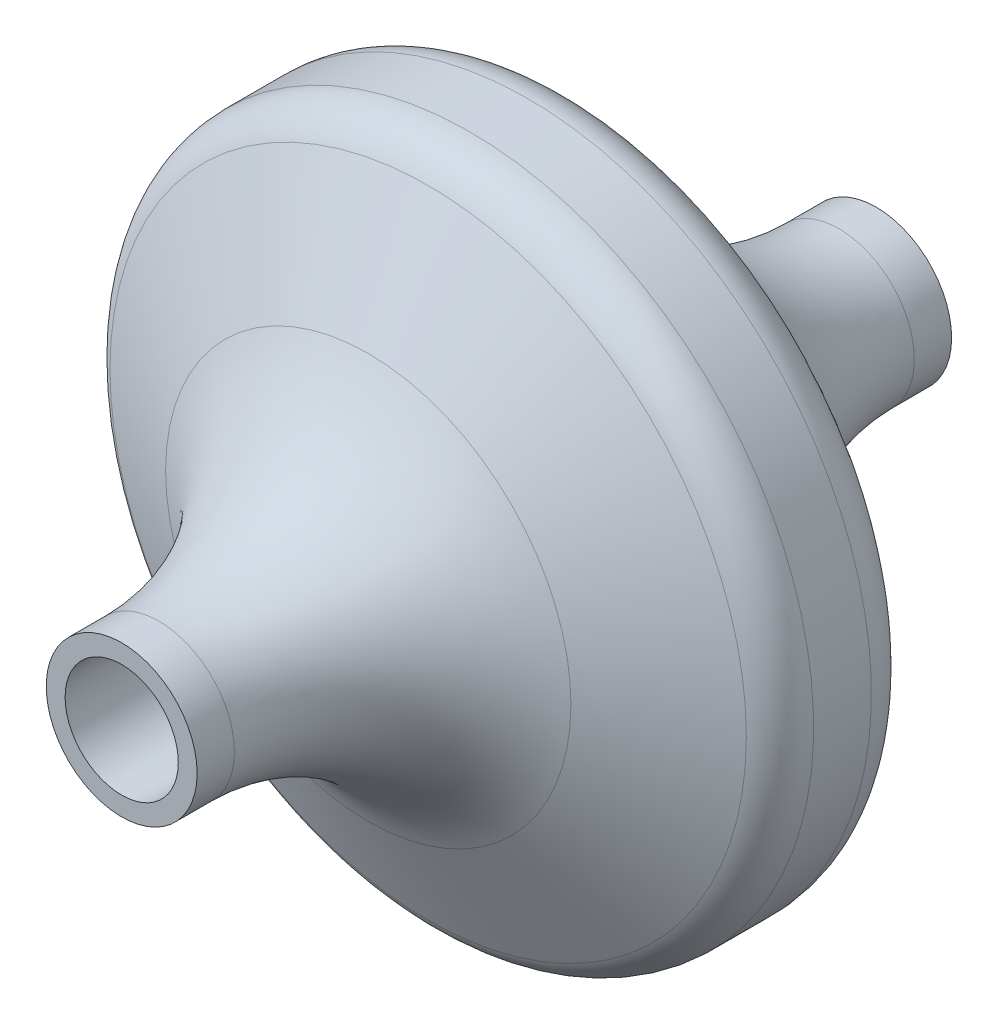
ISO-10303-21;
HEADER;
FILE_DESCRIPTION(('STEP AP214'),'2;1');
FILE_NAME('part.step','',(''),(''),'','','');
FILE_SCHEMA(('AUTOMOTIVE_DESIGN { 1 0 10303 214 1 1 1 1 }'));
ENDSEC;
DATA;
#1=APPLICATION_CONTEXT('core data for automotive mechanical design processes');
#2=APPLICATION_PROTOCOL_DEFINITION('international standard','automotive_design',2000,#1);
#3=PRODUCT_CONTEXT('',#1,'mechanical');
#4=PRODUCT('Part','Part','',(#3));
#5=PRODUCT_RELATED_PRODUCT_CATEGORY('part','',(#4));
#6=PRODUCT_DEFINITION_FORMATION('','',#4);
#7=PRODUCT_DEFINITION_CONTEXT('part definition',#1,'design');
#8=PRODUCT_DEFINITION('design','',#6,#7);
#9=PRODUCT_DEFINITION_SHAPE('','',#8);
#10=(LENGTH_UNIT() NAMED_UNIT(*) SI_UNIT(.MILLI.,.METRE.));
#11=(NAMED_UNIT(*) PLANE_ANGLE_UNIT() SI_UNIT($,.RADIAN.));
#12=(NAMED_UNIT(*) SI_UNIT($,.STERADIAN.) SOLID_ANGLE_UNIT());
#13=UNCERTAINTY_MEASURE_WITH_UNIT(LENGTH_MEASURE(1.E-05),#10,'distance_accuracy_value','');
#14=(GEOMETRIC_REPRESENTATION_CONTEXT(3) GLOBAL_UNCERTAINTY_ASSIGNED_CONTEXT((#13)) GLOBAL_UNIT_ASSIGNED_CONTEXT((#10,
#11,#12)) REPRESENTATION_CONTEXT('',''));
#15=CARTESIAN_POINT('',(0.,0.,0.));
#16=DIRECTION('',(0.,0.,1.));
#17=DIRECTION('',(1.,0.,0.));
#18=AXIS2_PLACEMENT_3D('',#15,#16,#17);
#19=CARTESIAN_POINT('',(0.,0.,40.));
#20=DIRECTION('',(0.,0.,-1.));
#21=DIRECTION('',(-1.,0.,0.));
#22=AXIS2_PLACEMENT_3D('',#19,#20,#21);
#23=CYLINDRICAL_SURFACE('',#22,8.);
#24=CARTESIAN_POINT('',(0.,0.,-36.0475266024994));
#25=DIRECTION('',(0.,0.,-1.));
#26=DIRECTION('',(-1.,0.,0.));
#27=AXIS2_PLACEMENT_3D('',#24,#25,#26);
#28=CIRCLE('',#27,8.);
#29=CARTESIAN_POINT('',(-8.,0.,-36.0475266024994));
#30=VERTEX_POINT('',#29);
#31=EDGE_CURVE('E109',#30,#30,#28,.T.);
#32=ORIENTED_EDGE('',*,*,#31,.T.);
#33=EDGE_LOOP('',(#32));
#34=FACE_BOUND('',#33,.T.);
#35=CARTESIAN_POINT('',(0.,0.,-40.));
#36=DIRECTION('',(0.,0.,1.));
#37=DIRECTION('',(1.,0.,0.));
#38=AXIS2_PLACEMENT_3D('',#35,#36,#37);
#39=CIRCLE('',#38,8.);
#40=CARTESIAN_POINT('',(8.,0.,-40.));
#41=VERTEX_POINT('',#40);
#42=EDGE_CURVE('E96',#41,#41,#39,.T.);
#43=ORIENTED_EDGE('',*,*,#42,.T.);
#44=EDGE_LOOP('',(#43));
#45=FACE_BOUND('',#44,.T.);
#46=ADVANCED_FACE('F33',(#34,#45),#23,.T.);
#47=CARTESIAN_POINT('',(0.,0.,40.));
#48=DIRECTION('',(0.,0.,-1.));
#49=DIRECTION('',(-1.,0.,0.));
#50=AXIS2_PLACEMENT_3D('',#47,#48,#49);
#51=CYLINDRICAL_SURFACE('',#50,6.);
#52=CARTESIAN_POINT('',(0.,0.,-21.8882467841348));
#53=DIRECTION('',(0.,0.,1.));
#54=DIRECTION('',(1.,0.,0.));
#55=AXIS2_PLACEMENT_3D('',#52,#53,#54);
#56=CIRCLE('',#55,6.);
#57=CARTESIAN_POINT('',(6.,0.,-21.8882467841348));
#58=VERTEX_POINT('',#57);
#59=EDGE_CURVE('E99',#58,#58,#56,.F.);
#60=ORIENTED_EDGE('',*,*,#59,.F.);
#61=EDGE_LOOP('',(#60));
#62=FACE_BOUND('',#61,.T.);
#63=CARTESIAN_POINT('',(0.,0.,-40.));
#64=DIRECTION('',(0.,0.,1.));
#65=DIRECTION('',(1.,0.,0.));
#66=AXIS2_PLACEMENT_3D('',#63,#64,#65);
#67=CIRCLE('',#66,6.);
#68=CARTESIAN_POINT('',(6.,0.,-40.));
#69=VERTEX_POINT('',#68);
#70=EDGE_CURVE('E105',#69,#69,#67,.T.);
#71=ORIENTED_EDGE('',*,*,#70,.F.);
#72=EDGE_LOOP('',(#71));
#73=FACE_BOUND('',#72,.T.);
#74=ADVANCED_FACE('F59',(#62,#73),#51,.F.);
#75=CARTESIAN_POINT('',(0.,0.,-40.));
#76=DIRECTION('',(0.,0.,1.));
#77=DIRECTION('',(1.,0.,0.));
#78=AXIS2_PLACEMENT_3D('',#75,#76,#77);
#79=PLANE('',#78);
#80=ORIENTED_EDGE('',*,*,#42,.F.);
#81=EDGE_LOOP('',(#80));
#82=FACE_BOUND('',#81,.T.);
#83=ORIENTED_EDGE('',*,*,#70,.T.);
#84=EDGE_LOOP('',(#83));
#85=FACE_BOUND('',#84,.T.);
#86=ADVANCED_FACE('F50',(#82,#85),#79,.F.);
#87=CARTESIAN_POINT('',(0.,0.,-25.));
#88=DIRECTION('',(0.,0.,1.));
#89=DIRECTION('',(1.,0.,0.));
#90=AXIS2_PLACEMENT_3D('',#87,#88,#89);
#91=CONICAL_SURFACE('',#90,0.,1.09235955777758);
#92=ORIENTED_EDGE('',*,*,#59,.T.);
#93=EDGE_LOOP('',(#92));
#94=FACE_BOUND('',#93,.T.);
#95=CARTESIAN_POINT('',(0.,0.,-25.));
#96=VERTEX_POINT('',#95);
#97=VERTEX_LOOP('',#96);
#98=FACE_BOUND('',#97,.T.);
#99=ADVANCED_FACE('F47',(#94,#98),#91,.T.);
#100=CARTESIAN_POINT('',(0.,0.,-13.8546339467728));
#101=DIRECTION('',(0.,0.,-1.));
#102=DIRECTION('',(-1.,0.,0.));
#103=AXIS2_PLACEMENT_3D('',#100,#101,#102);
#104=CIRCLE('',#103,21.4901991515319);
#105=CARTESIAN_POINT('',(-21.4901991515319,0.,-13.8546339467728));
#106=VERTEX_POINT('',#105);
#107=EDGE_CURVE('E111',#106,#106,#104,.F.);
#108=ORIENTED_EDGE('',*,*,#107,.T.);
#109=EDGE_LOOP('',(#108));
#110=FACE_BOUND('',#109,.T.);
#111=CARTESIAN_POINT('',(0.,0.,-7.50298286315338));
#112=DIRECTION('',(0.,0.,-1.));
#113=DIRECTION('',(-1.,0.,0.));
#114=AXIS2_PLACEMENT_3D('',#111,#112,#113);
#115=CIRCLE('',#114,33.7372842697906);
#116=CARTESIAN_POINT('',(-33.7372842697906,0.,-7.50298286315338));
#117=VERTEX_POINT('',#116);
#118=EDGE_CURVE('E152',#117,#117,#115,.T.);
#119=ORIENTED_EDGE('',*,*,#118,.T.);
#120=EDGE_LOOP('',(#119));
#121=FACE_BOUND('',#120,.T.);
#122=ADVANCED_FACE('F49',(#110,#121),#91,.T.);
#123=CARTESIAN_POINT('',(0.,0.,7.50298286315338));
#124=DIRECTION('',(0.,0.,-1.));
#125=DIRECTION('',(-1.,0.,0.));
#126=AXIS2_PLACEMENT_3D('',#123,#124,#125);
#127=CONICAL_SURFACE('',#126,33.7372842697906,1.09235955777758);
#128=CARTESIAN_POINT('',(0.,0.,13.8546339467728));
#129=DIRECTION('',(0.,0.,1.));
#130=DIRECTION('',(1.,0.,0.));
#131=AXIS2_PLACEMENT_3D('',#128,#129,#130);
#132=CIRCLE('',#131,21.4901991515319);
#133=CARTESIAN_POINT('',(21.4901991515319,0.,13.8546339467728));
#134=VERTEX_POINT('',#133);
#135=EDGE_CURVE('E11',#134,#134,#132,.F.);
#136=ORIENTED_EDGE('',*,*,#135,.T.);
#137=EDGE_LOOP('',(#136));
#138=FACE_BOUND('',#137,.T.);
#139=CARTESIAN_POINT('',(0.,0.,7.50298286315338));
#140=DIRECTION('',(0.,0.,-1.));
#141=DIRECTION('',(-1.,0.,0.));
#142=AXIS2_PLACEMENT_3D('',#139,#140,#141);
#143=CIRCLE('',#142,33.7372842697906);
#144=CARTESIAN_POINT('',(-33.7372842697906,0.,7.50298286315338));
#145=VERTEX_POINT('',#144);
#146=EDGE_CURVE('E143',#145,#145,#143,.T.);
#147=ORIENTED_EDGE('',*,*,#146,.F.);
#148=EDGE_LOOP('',(#147));
#149=FACE_BOUND('',#148,.T.);
#150=ADVANCED_FACE('F57',(#138,#149),#127,.T.);
#151=CARTESIAN_POINT('',(0.,0.,-3.06440433200805));
#152=DIRECTION('',(0.,0.,-1.));
#153=DIRECTION('',(-1.,0.,0.));
#154=AXIS2_PLACEMENT_3D('',#151,#152,#153);
#155=TOROIDAL_SURFACE('',#154,31.435324100097,5.00000000000001);
#156=CARTESIAN_POINT('',(0.,0.,-3.06440433200805));
#157=DIRECTION('',(0.,0.,-1.));
#158=DIRECTION('',(-1.,0.,0.));
#159=AXIS2_PLACEMENT_3D('',#156,#157,#158);
#160=CIRCLE('',#159,36.435324100097);
#161=CARTESIAN_POINT('',(-36.435324100097,0.,-3.06440433200805));
#162=VERTEX_POINT('',#161);
#163=EDGE_CURVE('E147',#162,#162,#160,.T.);
#164=ORIENTED_EDGE('',*,*,#163,.T.);
#165=EDGE_LOOP('',(#164));
#166=FACE_BOUND('',#165,.T.);
#167=ORIENTED_EDGE('',*,*,#118,.F.);
#168=EDGE_LOOP('',(#167));
#169=FACE_BOUND('',#168,.T.);
#170=ADVANCED_FACE('F133',(#166,#169),#155,.T.);
#171=CARTESIAN_POINT('',(0.,0.,-25.));
#172=DIRECTION('',(0.,0.,-1.));
#173=DIRECTION('',(-1.,0.,0.));
#174=AXIS2_PLACEMENT_3D('',#171,#172,#173);
#175=CYLINDRICAL_SURFACE('',#174,36.435324100097);
#176=CARTESIAN_POINT('',(0.,0.,3.06440433200805));
#177=DIRECTION('',(0.,0.,-1.));
#178=DIRECTION('',(-1.,0.,0.));
#179=AXIS2_PLACEMENT_3D('',#176,#177,#178);
#180=CIRCLE('',#179,36.435324100097);
#181=CARTESIAN_POINT('',(-36.435324100097,0.,3.06440433200805));
#182=VERTEX_POINT('',#181);
#183=EDGE_CURVE('E144',#182,#182,#180,.T.);
#184=ORIENTED_EDGE('',*,*,#183,.T.);
#185=EDGE_LOOP('',(#184));
#186=FACE_BOUND('',#185,.T.);
#187=ORIENTED_EDGE('',*,*,#163,.F.);
#188=EDGE_LOOP('',(#187));
#189=FACE_BOUND('',#188,.T.);
#190=ADVANCED_FACE('F86',(#186,#189),#175,.T.);
#191=CARTESIAN_POINT('',(0.,0.,3.06440433200805));
#192=DIRECTION('',(0.,0.,-1.));
#193=DIRECTION('',(-1.,0.,0.));
#194=AXIS2_PLACEMENT_3D('',#191,#192,#193);
#195=TOROIDAL_SURFACE('',#194,31.435324100097,5.00000000000001);
#196=ORIENTED_EDGE('',*,*,#146,.T.);
#197=EDGE_LOOP('',(#196));
#198=FACE_BOUND('',#197,.T.);
#199=ORIENTED_EDGE('',*,*,#183,.F.);
#200=EDGE_LOOP('',(#199));
#201=FACE_BOUND('',#200,.T.);
#202=ADVANCED_FACE('F78',(#198,#201),#195,.T.);
#203=CARTESIAN_POINT('',(0.,0.,36.0475266024994));
#204=DIRECTION('',(0.,0.,1.));
#205=DIRECTION('',(1.,0.,0.));
#206=AXIS2_PLACEMENT_3D('',#203,#204,#205);
#207=CIRCLE('',#206,8.);
#208=CARTESIAN_POINT('',(8.,0.,36.0475266024994));
#209=VERTEX_POINT('',#208);
#210=EDGE_CURVE('E41',#209,#209,#207,.T.);
#211=ORIENTED_EDGE('',*,*,#210,.T.);
#212=EDGE_LOOP('',(#211));
#213=FACE_BOUND('',#212,.T.);
#214=CARTESIAN_POINT('',(0.,0.,40.));
#215=DIRECTION('',(0.,0.,1.));
#216=DIRECTION('',(1.,0.,0.));
#217=AXIS2_PLACEMENT_3D('',#214,#215,#216);
#218=CIRCLE('',#217,8.);
#219=CARTESIAN_POINT('',(8.,0.,40.));
#220=VERTEX_POINT('',#219);
#221=EDGE_CURVE('E94',#220,#220,#218,.T.);
#222=ORIENTED_EDGE('',*,*,#221,.F.);
#223=EDGE_LOOP('',(#222));
#224=FACE_BOUND('',#223,.T.);
#225=ADVANCED_FACE('F68',(#213,#224),#23,.T.);
#226=CARTESIAN_POINT('',(0.,0.,40.));
#227=DIRECTION('',(0.,0.,1.));
#228=DIRECTION('',(1.,0.,0.));
#229=AXIS2_PLACEMENT_3D('',#226,#227,#228);
#230=PLANE('',#229);
#231=ORIENTED_EDGE('',*,*,#221,.T.);
#232=EDGE_LOOP('',(#231));
#233=FACE_BOUND('',#232,.T.);
#234=CARTESIAN_POINT('',(0.,0.,40.));
#235=DIRECTION('',(0.,0.,1.));
#236=DIRECTION('',(1.,0.,0.));
#237=AXIS2_PLACEMENT_3D('',#234,#235,#236);
#238=CIRCLE('',#237,6.);
#239=CARTESIAN_POINT('',(6.,0.,40.));
#240=VERTEX_POINT('',#239);
#241=EDGE_CURVE('E102',#240,#240,#238,.T.);
#242=ORIENTED_EDGE('',*,*,#241,.F.);
#243=EDGE_LOOP('',(#242));
#244=FACE_BOUND('',#243,.T.);
#245=ADVANCED_FACE('F77',(#233,#244),#230,.T.);
#246=CARTESIAN_POINT('',(0.,0.,21.8882467841348));
#247=DIRECTION('',(0.,0.,-1.));
#248=DIRECTION('',(-1.,0.,0.));
#249=AXIS2_PLACEMENT_3D('',#246,#247,#248);
#250=CIRCLE('',#249,6.);
#251=CARTESIAN_POINT('',(-6.,0.,21.8882467841348));
#252=VERTEX_POINT('',#251);
#253=EDGE_CURVE('E95',#252,#252,#250,.F.);
#254=ORIENTED_EDGE('',*,*,#253,.F.);
#255=EDGE_LOOP('',(#254));
#256=FACE_BOUND('',#255,.T.);
#257=ORIENTED_EDGE('',*,*,#241,.T.);
#258=EDGE_LOOP('',(#257));
#259=FACE_BOUND('',#258,.T.);
#260=ADVANCED_FACE('F73',(#256,#259),#51,.F.);
#261=ORIENTED_EDGE('',*,*,#253,.T.);
#262=EDGE_LOOP('',(#261));
#263=FACE_BOUND('',#262,.T.);
#264=CARTESIAN_POINT('',(0.,0.,25.));
#265=VERTEX_POINT('',#264);
#266=VERTEX_LOOP('',#265);
#267=FACE_BOUND('',#266,.T.);
#268=ADVANCED_FACE('F119',(#263,#267),#127,.T.);
#269=CARTESIAN_POINT('',(0.,0.,-36.0475266024994));
#270=DIRECTION('',(0.,0.,-1.));
#271=DIRECTION('',(-1.,0.,0.));
#272=AXIS2_PLACEMENT_3D('',#269,#270,#271);
#273=TOROIDAL_SURFACE('',#272,33.,25.);
#274=ORIENTED_EDGE('',*,*,#107,.F.);
#275=EDGE_LOOP('',(#274));
#276=FACE_BOUND('',#275,.T.);
#277=ORIENTED_EDGE('',*,*,#31,.F.);
#278=EDGE_LOOP('',(#277));
#279=FACE_BOUND('',#278,.T.);
#280=ADVANCED_FACE('F116',(#276,#279),#273,.F.);
#281=CARTESIAN_POINT('',(0.,0.,36.0475266024994));
#282=DIRECTION('',(0.,0.,1.));
#283=DIRECTION('',(1.,0.,0.));
#284=AXIS2_PLACEMENT_3D('',#281,#282,#283);
#285=TOROIDAL_SURFACE('',#284,33.,25.);
#286=ORIENTED_EDGE('',*,*,#135,.F.);
#287=EDGE_LOOP('',(#286));
#288=FACE_BOUND('',#287,.T.);
#289=ORIENTED_EDGE('',*,*,#210,.F.);
#290=EDGE_LOOP('',(#289));
#291=FACE_BOUND('',#290,.T.);
#292=ADVANCED_FACE('F35',(#288,#291),#285,.F.);
#293=CLOSED_SHELL('',(#46,#74,#86,#99,#122,#150,#170,#190,#202,#225,#245,#260,#268,#280,#292));
#294=MANIFOLD_SOLID_BREP('B2',#293);
#295=ADVANCED_BREP_SHAPE_REPRESENTATION('',(#18,#294),#14);
#296=SHAPE_DEFINITION_REPRESENTATION(#9,#295);
ENDSEC;
END-ISO-10303-21;
